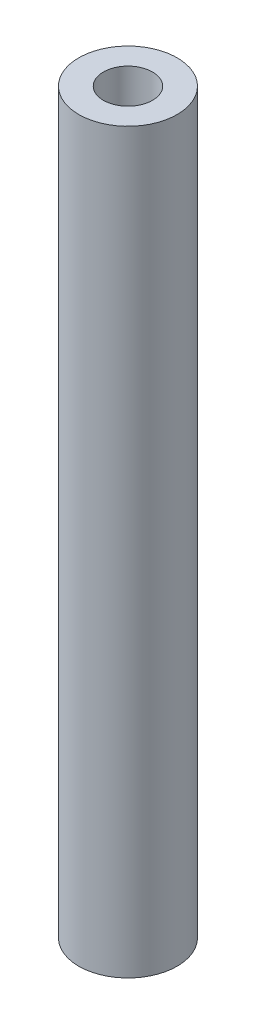
ISO-10303-21;
HEADER;
FILE_DESCRIPTION(('STEP AP214'),'2;1');
FILE_NAME('part.step','',(''),(''),'','','');
FILE_SCHEMA(('AUTOMOTIVE_DESIGN { 1 0 10303 214 1 1 1 1 }'));
ENDSEC;
DATA;
#1=APPLICATION_CONTEXT('core data for automotive mechanical design processes');
#2=APPLICATION_PROTOCOL_DEFINITION('international standard','automotive_design',2000,#1);
#3=PRODUCT_CONTEXT('',#1,'mechanical');
#4=PRODUCT('Part','Part','',(#3));
#5=PRODUCT_RELATED_PRODUCT_CATEGORY('part','',(#4));
#6=PRODUCT_DEFINITION_FORMATION('','',#4);
#7=PRODUCT_DEFINITION_CONTEXT('part definition',#1,'design');
#8=PRODUCT_DEFINITION('design','',#6,#7);
#9=PRODUCT_DEFINITION_SHAPE('','',#8);
#10=(LENGTH_UNIT() NAMED_UNIT(*) SI_UNIT(.MILLI.,.METRE.));
#11=(NAMED_UNIT(*) PLANE_ANGLE_UNIT() SI_UNIT($,.RADIAN.));
#12=(NAMED_UNIT(*) SI_UNIT($,.STERADIAN.) SOLID_ANGLE_UNIT());
#13=UNCERTAINTY_MEASURE_WITH_UNIT(LENGTH_MEASURE(1.E-05),#10,'distance_accuracy_value','');
#14=(GEOMETRIC_REPRESENTATION_CONTEXT(3) GLOBAL_UNCERTAINTY_ASSIGNED_CONTEXT((#13)) GLOBAL_UNIT_ASSIGNED_CONTEXT((#10,
#11,#12)) REPRESENTATION_CONTEXT('',''));
#15=CARTESIAN_POINT('',(0.,0.,0.));
#16=DIRECTION('',(0.,0.,1.));
#17=DIRECTION('',(1.,0.,0.));
#18=AXIS2_PLACEMENT_3D('',#15,#16,#17);
#19=CARTESIAN_POINT('',(0.,30.,0.));
#20=DIRECTION('',(0.,1.,0.));
#21=DIRECTION('',(0.,0.,1.));
#22=AXIS2_PLACEMENT_3D('',#19,#20,#21);
#23=PLANE('',#22);
#24=CARTESIAN_POINT('',(0.,30.,0.));
#25=DIRECTION('',(0.,1.,0.));
#26=DIRECTION('',(0.,0.,1.));
#27=AXIS2_PLACEMENT_3D('',#24,#25,#26);
#28=CIRCLE('',#27,2.);
#29=CARTESIAN_POINT('',(0.,30.,2.));
#30=VERTEX_POINT('',#29);
#31=EDGE_CURVE('E10',#30,#30,#28,.T.);
#32=ORIENTED_EDGE('',*,*,#31,.T.);
#33=EDGE_LOOP('',(#32));
#34=FACE_BOUND('',#33,.T.);
#35=CARTESIAN_POINT('',(0.,30.,0.));
#36=DIRECTION('',(0.,1.,0.));
#37=DIRECTION('',(0.,0.,1.));
#38=AXIS2_PLACEMENT_3D('',#35,#36,#37);
#39=CIRCLE('',#38,1.);
#40=CARTESIAN_POINT('',(0.,30.,1.));
#41=VERTEX_POINT('',#40);
#42=EDGE_CURVE('E43',#41,#41,#39,.T.);
#43=ORIENTED_EDGE('',*,*,#42,.F.);
#44=EDGE_LOOP('',(#43));
#45=FACE_BOUND('',#44,.T.);
#46=ADVANCED_FACE('F32',(#34,#45),#23,.T.);
#47=CARTESIAN_POINT('',(0.,0.,0.));
#48=DIRECTION('',(0.,1.,0.));
#49=DIRECTION('',(0.,0.,1.));
#50=AXIS2_PLACEMENT_3D('',#47,#48,#49);
#51=PLANE('',#50);
#52=CARTESIAN_POINT('',(0.,0.,0.));
#53=DIRECTION('',(0.,1.,0.));
#54=DIRECTION('',(0.,0.,1.));
#55=AXIS2_PLACEMENT_3D('',#52,#53,#54);
#56=CIRCLE('',#55,2.);
#57=CARTESIAN_POINT('',(0.,0.,2.));
#58=VERTEX_POINT('',#57);
#59=EDGE_CURVE('E36',#58,#58,#56,.T.);
#60=ORIENTED_EDGE('',*,*,#59,.F.);
#61=EDGE_LOOP('',(#60));
#62=FACE_BOUND('',#61,.T.);
#63=CARTESIAN_POINT('',(0.,0.,0.));
#64=DIRECTION('',(0.,1.,0.));
#65=DIRECTION('',(0.,0.,1.));
#66=AXIS2_PLACEMENT_3D('',#63,#64,#65);
#67=CIRCLE('',#66,1.);
#68=CARTESIAN_POINT('',(0.,0.,1.));
#69=VERTEX_POINT('',#68);
#70=EDGE_CURVE('E45',#69,#69,#67,.T.);
#71=ORIENTED_EDGE('',*,*,#70,.T.);
#72=EDGE_LOOP('',(#71));
#73=FACE_BOUND('',#72,.T.);
#74=ADVANCED_FACE('F55',(#62,#73),#51,.F.);
#75=CARTESIAN_POINT('',(0.,30.,0.));
#76=DIRECTION('',(0.,-1.,0.));
#77=DIRECTION('',(0.,0.,-1.));
#78=AXIS2_PLACEMENT_3D('',#75,#76,#77);
#79=CYLINDRICAL_SURFACE('',#78,2.);
#80=ORIENTED_EDGE('',*,*,#31,.F.);
#81=EDGE_LOOP('',(#80));
#82=FACE_BOUND('',#81,.T.);
#83=ORIENTED_EDGE('',*,*,#59,.T.);
#84=EDGE_LOOP('',(#83));
#85=FACE_BOUND('',#84,.T.);
#86=ADVANCED_FACE('F34',(#82,#85),#79,.T.);
#87=CARTESIAN_POINT('',(0.,30.,0.));
#88=DIRECTION('',(0.,-1.,0.));
#89=DIRECTION('',(0.,0.,-1.));
#90=AXIS2_PLACEMENT_3D('',#87,#88,#89);
#91=CYLINDRICAL_SURFACE('',#90,1.);
#92=ORIENTED_EDGE('',*,*,#42,.T.);
#93=EDGE_LOOP('',(#92));
#94=FACE_BOUND('',#93,.T.);
#95=ORIENTED_EDGE('',*,*,#70,.F.);
#96=EDGE_LOOP('',(#95));
#97=FACE_BOUND('',#96,.T.);
#98=ADVANCED_FACE('F51',(#94,#97),#91,.F.);
#99=CLOSED_SHELL('',(#46,#74,#86,#98));
#100=MANIFOLD_SOLID_BREP('B2',#99);
#101=ADVANCED_BREP_SHAPE_REPRESENTATION('',(#18,#100),#14);
#102=SHAPE_DEFINITION_REPRESENTATION(#9,#101);
ENDSEC;
END-ISO-10303-21;
